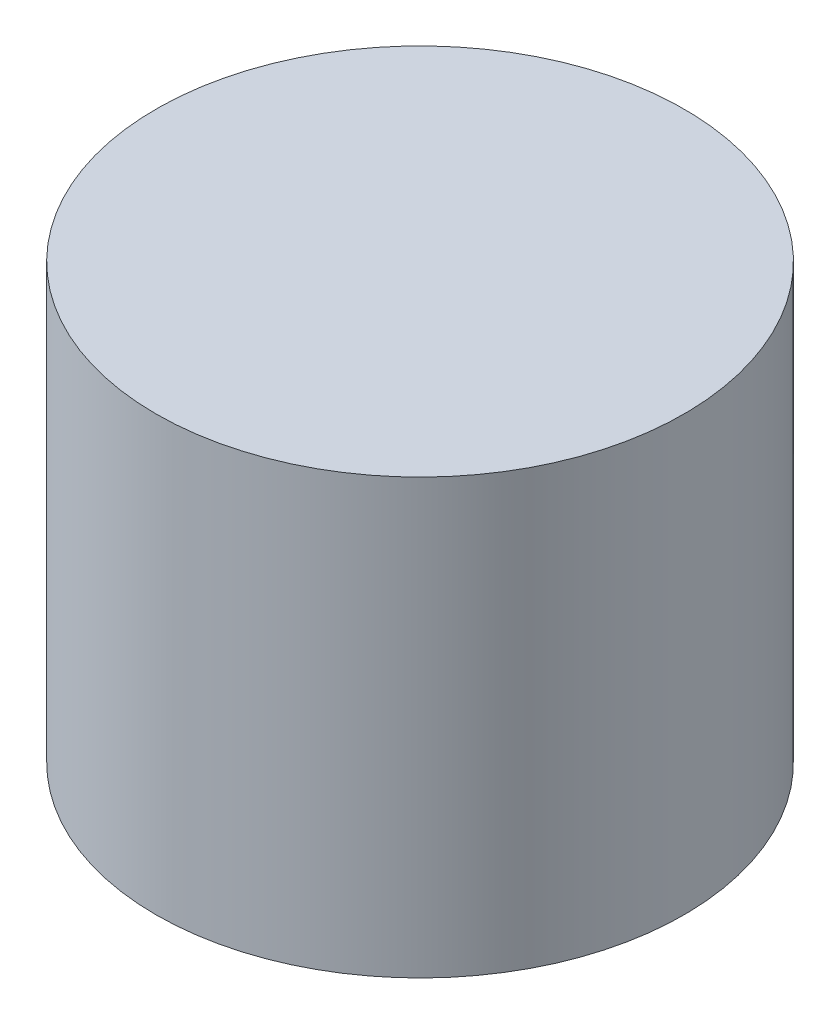
ISO-10303-21;
HEADER;
FILE_DESCRIPTION(('STEP AP214'),'2;1');
FILE_NAME('part.step','',(''),(''),'','','');
FILE_SCHEMA(('AUTOMOTIVE_DESIGN { 1 0 10303 214 1 1 1 1 }'));
ENDSEC;
DATA;
#1=APPLICATION_CONTEXT('core data for automotive mechanical design processes');
#2=APPLICATION_PROTOCOL_DEFINITION('international standard','automotive_design',2000,#1);
#3=PRODUCT_CONTEXT('',#1,'mechanical');
#4=PRODUCT('Part','Part','',(#3));
#5=PRODUCT_RELATED_PRODUCT_CATEGORY('part','',(#4));
#6=PRODUCT_DEFINITION_FORMATION('','',#4);
#7=PRODUCT_DEFINITION_CONTEXT('part definition',#1,'design');
#8=PRODUCT_DEFINITION('design','',#6,#7);
#9=PRODUCT_DEFINITION_SHAPE('','',#8);
#10=(LENGTH_UNIT() NAMED_UNIT(*) SI_UNIT(.MILLI.,.METRE.));
#11=(NAMED_UNIT(*) PLANE_ANGLE_UNIT() SI_UNIT($,.RADIAN.));
#12=(NAMED_UNIT(*) SI_UNIT($,.STERADIAN.) SOLID_ANGLE_UNIT());
#13=UNCERTAINTY_MEASURE_WITH_UNIT(LENGTH_MEASURE(1.E-05),#10,'distance_accuracy_value','');
#14=(GEOMETRIC_REPRESENTATION_CONTEXT(3) GLOBAL_UNCERTAINTY_ASSIGNED_CONTEXT((#13)) GLOBAL_UNIT_ASSIGNED_CONTEXT((#10,
#11,#12)) REPRESENTATION_CONTEXT('',''));
#15=CARTESIAN_POINT('',(0.,0.,0.));
#16=DIRECTION('',(0.,0.,1.));
#17=DIRECTION('',(1.,0.,0.));
#18=AXIS2_PLACEMENT_3D('',#15,#16,#17);
#19=CARTESIAN_POINT('',(0.,4.6,0.));
#20=DIRECTION('',(0.,-1.,0.));
#21=DIRECTION('',(0.,0.,-1.));
#22=AXIS2_PLACEMENT_3D('',#19,#20,#21);
#23=CYLINDRICAL_SURFACE('',#22,2.8);
#24=CARTESIAN_POINT('',(0.,4.6,0.));
#25=DIRECTION('',(0.,1.,0.));
#26=DIRECTION('',(0.,0.,1.));
#27=AXIS2_PLACEMENT_3D('',#24,#25,#26);
#28=CIRCLE('',#27,2.8);
#29=CARTESIAN_POINT('',(0.,4.6,2.8));
#30=VERTEX_POINT('',#29);
#31=EDGE_CURVE('E10',#30,#30,#28,.T.);
#32=ORIENTED_EDGE('',*,*,#31,.F.);
#33=EDGE_LOOP('',(#32));
#34=FACE_BOUND('',#33,.T.);
#35=CARTESIAN_POINT('',(0.,0.,0.));
#36=DIRECTION('',(0.,1.,0.));
#37=DIRECTION('',(0.,0.,1.));
#38=AXIS2_PLACEMENT_3D('',#35,#36,#37);
#39=CIRCLE('',#38,2.8);
#40=CARTESIAN_POINT('',(0.,0.,2.8));
#41=VERTEX_POINT('',#40);
#42=EDGE_CURVE('E35',#41,#41,#39,.T.);
#43=ORIENTED_EDGE('',*,*,#42,.T.);
#44=EDGE_LOOP('',(#43));
#45=FACE_BOUND('',#44,.T.);
#46=ADVANCED_FACE('F32',(#34,#45),#23,.T.);
#47=CARTESIAN_POINT('',(0.,4.6,0.));
#48=DIRECTION('',(0.,1.,0.));
#49=DIRECTION('',(0.,0.,1.));
#50=AXIS2_PLACEMENT_3D('',#47,#48,#49);
#51=PLANE('',#50);
#52=ORIENTED_EDGE('',*,*,#31,.T.);
#53=EDGE_LOOP('',(#52));
#54=FACE_BOUND('',#53,.T.);
#55=ADVANCED_FACE('F47',(#54),#51,.T.);
#56=CARTESIAN_POINT('',(0.,0.,0.));
#57=DIRECTION('',(0.,1.,0.));
#58=DIRECTION('',(0.,0.,1.));
#59=AXIS2_PLACEMENT_3D('',#56,#57,#58);
#60=PLANE('',#59);
#61=ORIENTED_EDGE('',*,*,#42,.F.);
#62=EDGE_LOOP('',(#61));
#63=FACE_BOUND('',#62,.T.);
#64=ADVANCED_FACE('F45',(#63),#60,.F.);
#65=CLOSED_SHELL('',(#46,#55,#64));
#66=MANIFOLD_SOLID_BREP('B2',#65);
#67=ADVANCED_BREP_SHAPE_REPRESENTATION('',(#18,#66),#14);
#68=SHAPE_DEFINITION_REPRESENTATION(#9,#67);
ENDSEC;
END-ISO-10303-21;
